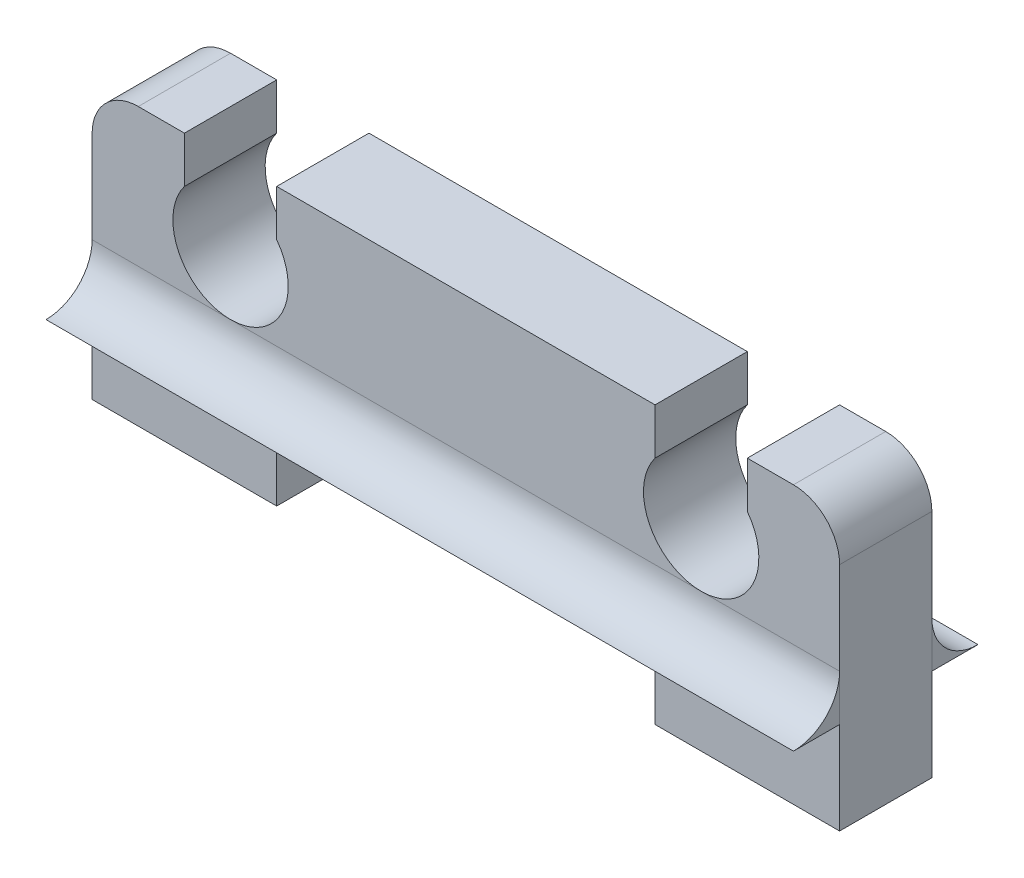
ISO-10303-21;
HEADER;
FILE_DESCRIPTION(('STEP AP214'),'2;1');
FILE_NAME('part.step','',(''),(''),'','','');
FILE_SCHEMA(('AUTOMOTIVE_DESIGN { 1 0 10303 214 1 1 1 1 }'));
ENDSEC;
DATA;
#1=APPLICATION_CONTEXT('core data for automotive mechanical design processes');
#2=APPLICATION_PROTOCOL_DEFINITION('international standard','automotive_design',2000,#1);
#3=PRODUCT_CONTEXT('',#1,'mechanical');
#4=PRODUCT('Part','Part','',(#3));
#5=PRODUCT_RELATED_PRODUCT_CATEGORY('part','',(#4));
#6=PRODUCT_DEFINITION_FORMATION('','',#4);
#7=PRODUCT_DEFINITION_CONTEXT('part definition',#1,'design');
#8=PRODUCT_DEFINITION('design','',#6,#7);
#9=PRODUCT_DEFINITION_SHAPE('','',#8);
#10=(LENGTH_UNIT() NAMED_UNIT(*) SI_UNIT(.MILLI.,.METRE.));
#11=(NAMED_UNIT(*) PLANE_ANGLE_UNIT() SI_UNIT($,.RADIAN.));
#12=(NAMED_UNIT(*) SI_UNIT($,.STERADIAN.) SOLID_ANGLE_UNIT());
#13=UNCERTAINTY_MEASURE_WITH_UNIT(LENGTH_MEASURE(1.E-05),#10,'distance_accuracy_value','');
#14=(GEOMETRIC_REPRESENTATION_CONTEXT(3) GLOBAL_UNCERTAINTY_ASSIGNED_CONTEXT((#13)) GLOBAL_UNIT_ASSIGNED_CONTEXT((#10,
#11,#12)) REPRESENTATION_CONTEXT('',''));
#15=CARTESIAN_POINT('',(0.,0.,0.));
#16=DIRECTION('',(0.,0.,1.));
#17=DIRECTION('',(1.,0.,0.));
#18=AXIS2_PLACEMENT_3D('',#15,#16,#17);
#19=CARTESIAN_POINT('',(16.2,5.,-1.));
#20=DIRECTION('',(-1.,0.,0.));
#21=DIRECTION('',(0.,0.,1.));
#22=AXIS2_PLACEMENT_3D('',#19,#20,#21);
#23=CYLINDRICAL_SURFACE('',#22,1.);
#24=CARTESIAN_POINT('',(0.,5.,-1.));
#25=DIRECTION('',(1.,0.,0.));
#26=DIRECTION('',(0.,0.,-1.));
#27=AXIS2_PLACEMENT_3D('',#24,#25,#26);
#28=CIRCLE('',#27,1.);
#29=CARTESIAN_POINT('',(0.,5.,0.));
#30=VERTEX_POINT('',#29);
#31=CARTESIAN_POINT('',(0.,4.,-1.));
#32=VERTEX_POINT('',#31);
#33=EDGE_CURVE('E97',#30,#32,#28,.T.);
#34=ORIENTED_EDGE('',*,*,#33,.F.);
#35=DIRECTION('',(-1.,0.,0.));
#36=VECTOR('',#35,1.);
#37=CARTESIAN_POINT('',(16.2,5.,0.));
#38=LINE('',#37,#36);
#39=CARTESIAN_POINT('',(16.2,5.,0.));
#40=VERTEX_POINT('',#39);
#41=EDGE_CURVE('E12',#40,#30,#38,.T.);
#42=ORIENTED_EDGE('',*,*,#41,.F.);
#43=CARTESIAN_POINT('',(16.2,5.,-1.));
#44=DIRECTION('',(1.,0.,0.));
#45=DIRECTION('',(0.,0.,-1.));
#46=AXIS2_PLACEMENT_3D('',#43,#44,#45);
#47=CIRCLE('',#46,1.);
#48=CARTESIAN_POINT('',(16.2,4.,-1.));
#49=VERTEX_POINT('',#48);
#50=EDGE_CURVE('E89',#40,#49,#47,.T.);
#51=ORIENTED_EDGE('',*,*,#50,.T.);
#52=DIRECTION('',(-1.,0.,0.));
#53=VECTOR('',#52,1.);
#54=CARTESIAN_POINT('',(16.2,4.,-1.));
#55=LINE('',#54,#53);
#56=EDGE_CURVE('E48',#49,#32,#55,.T.);
#57=ORIENTED_EDGE('',*,*,#56,.T.);
#58=EDGE_LOOP('',(#34,#42,#51,#57));
#59=FACE_BOUND('',#58,.T.);
#60=ADVANCED_FACE('F45',(#59),#23,.F.);
#61=CARTESIAN_POINT('',(16.2,4.,0.));
#62=DIRECTION('',(0.,0.,1.));
#63=DIRECTION('',(1.,0.,0.));
#64=AXIS2_PLACEMENT_3D('',#61,#62,#63);
#65=PLANE('',#64);
#66=DIRECTION('',(0.,1.,0.));
#67=VECTOR('',#66,1.);
#68=CARTESIAN_POINT('',(0.,4.,0.));
#69=LINE('',#68,#67);
#70=CARTESIAN_POINT('',(0.,4.,0.));
#71=VERTEX_POINT('',#70);
#72=EDGE_CURVE('E91',#71,#30,#69,.T.);
#73=ORIENTED_EDGE('',*,*,#72,.F.);
#74=DIRECTION('',(-1.,0.,0.));
#75=VECTOR('',#74,1.);
#76=CARTESIAN_POINT('',(16.2,4.,0.));
#77=LINE('',#76,#75);
#78=CARTESIAN_POINT('',(16.2,4.,0.));
#79=VERTEX_POINT('',#78);
#80=EDGE_CURVE('E54',#79,#71,#77,.T.);
#81=ORIENTED_EDGE('',*,*,#80,.F.);
#82=DIRECTION('',(0.,1.,0.));
#83=VECTOR('',#82,1.);
#84=CARTESIAN_POINT('',(16.2,4.,0.));
#85=LINE('',#84,#83);
#86=EDGE_CURVE('E86',#79,#40,#85,.T.);
#87=ORIENTED_EDGE('',*,*,#86,.T.);
#88=ORIENTED_EDGE('',*,*,#41,.T.);
#89=EDGE_LOOP('',(#73,#81,#87,#88));
#90=FACE_BOUND('',#89,.T.);
#91=ADVANCED_FACE('F101',(#90),#65,.T.);
#92=CARTESIAN_POINT('',(16.2,4.,0.));
#93=DIRECTION('',(0.,-1.,0.));
#94=DIRECTION('',(0.,0.,-1.));
#95=AXIS2_PLACEMENT_3D('',#92,#93,#94);
#96=PLANE('',#95);
#97=DIRECTION('',(0.,0.,1.));
#98=VECTOR('',#97,1.);
#99=CARTESIAN_POINT('',(0.,4.,0.));
#100=LINE('',#99,#98);
#101=EDGE_CURVE('E84',#32,#71,#100,.T.);
#102=ORIENTED_EDGE('',*,*,#101,.F.);
#103=ORIENTED_EDGE('',*,*,#56,.F.);
#104=DIRECTION('',(0.,0.,1.));
#105=VECTOR('',#104,1.);
#106=CARTESIAN_POINT('',(16.2,4.,0.));
#107=LINE('',#106,#105);
#108=EDGE_CURVE('E82',#49,#79,#107,.T.);
#109=ORIENTED_EDGE('',*,*,#108,.T.);
#110=ORIENTED_EDGE('',*,*,#80,.T.);
#111=EDGE_LOOP('',(#102,#103,#109,#110));
#112=FACE_BOUND('',#111,.T.);
#113=ADVANCED_FACE('F81',(#112),#96,.T.);
#114=CARTESIAN_POINT('',(16.2,5.,-1.));
#115=DIRECTION('',(1.,0.,0.));
#116=DIRECTION('',(0.,0.,-1.));
#117=AXIS2_PLACEMENT_3D('',#114,#115,#116);
#118=PLANE('',#117);
#119=ORIENTED_EDGE('',*,*,#50,.F.);
#120=ORIENTED_EDGE('',*,*,#86,.F.);
#121=ORIENTED_EDGE('',*,*,#108,.F.);
#122=EDGE_LOOP('',(#119,#120,#121));
#123=FACE_BOUND('',#122,.T.);
#124=ADVANCED_FACE('F88',(#123),#118,.T.);
#125=CARTESIAN_POINT('',(0.,5.,-1.));
#126=DIRECTION('',(1.,0.,0.));
#127=DIRECTION('',(0.,0.,-1.));
#128=AXIS2_PLACEMENT_3D('',#125,#126,#127);
#129=PLANE('',#128);
#130=ORIENTED_EDGE('',*,*,#33,.T.);
#131=ORIENTED_EDGE('',*,*,#101,.T.);
#132=ORIENTED_EDGE('',*,*,#72,.T.);
#133=EDGE_LOOP('',(#130,#131,#132));
#134=FACE_BOUND('',#133,.T.);
#135=ADVANCED_FACE('F100',(#134),#129,.F.);
#136=CLOSED_SHELL('',(#60,#91,#113,#124,#135));
#137=MANIFOLD_SOLID_BREP('B2',#136);
#138=CARTESIAN_POINT('',(16.2,4.,2.));
#139=DIRECTION('',(0.,-1.,0.));
#140=DIRECTION('',(0.,0.,-1.));
#141=AXIS2_PLACEMENT_3D('',#138,#139,#140);
#142=PLANE('',#141);
#143=DIRECTION('',(0.,0.,1.));
#144=VECTOR('',#143,1.);
#145=CARTESIAN_POINT('',(0.,4.,2.));
#146=LINE('',#145,#144);
#147=CARTESIAN_POINT('',(0.,4.,2.));
#148=VERTEX_POINT('',#147);
#149=CARTESIAN_POINT('',(0.,4.,3.));
#150=VERTEX_POINT('',#149);
#151=EDGE_CURVE('E203',#148,#150,#146,.T.);
#152=ORIENTED_EDGE('',*,*,#151,.F.);
#153=DIRECTION('',(-1.,0.,0.));
#154=VECTOR('',#153,1.);
#155=CARTESIAN_POINT('',(16.2,4.,2.));
#156=LINE('',#155,#154);
#157=CARTESIAN_POINT('',(16.2,4.,2.));
#158=VERTEX_POINT('',#157);
#159=EDGE_CURVE('E43',#158,#148,#156,.T.);
#160=ORIENTED_EDGE('',*,*,#159,.F.);
#161=DIRECTION('',(0.,0.,1.));
#162=VECTOR('',#161,1.);
#163=CARTESIAN_POINT('',(16.2,4.,2.));
#164=LINE('',#163,#162);
#165=CARTESIAN_POINT('',(16.2,4.,3.));
#166=VERTEX_POINT('',#165);
#167=EDGE_CURVE('E195',#158,#166,#164,.T.);
#168=ORIENTED_EDGE('',*,*,#167,.T.);
#169=DIRECTION('',(-1.,0.,0.));
#170=VECTOR('',#169,1.);
#171=CARTESIAN_POINT('',(16.2,4.,3.));
#172=LINE('',#171,#170);
#173=EDGE_CURVE('E154',#166,#150,#172,.T.);
#174=ORIENTED_EDGE('',*,*,#173,.T.);
#175=EDGE_LOOP('',(#152,#160,#168,#174));
#176=FACE_BOUND('',#175,.T.);
#177=ADVANCED_FACE('F151',(#176),#142,.T.);
#178=CARTESIAN_POINT('',(16.2,4.,2.));
#179=DIRECTION('',(0.,0.,-1.));
#180=DIRECTION('',(-1.,0.,0.));
#181=AXIS2_PLACEMENT_3D('',#178,#179,#180);
#182=PLANE('',#181);
#183=DIRECTION('',(0.,-1.,0.));
#184=VECTOR('',#183,1.);
#185=CARTESIAN_POINT('',(0.,4.,2.));
#186=LINE('',#185,#184);
#187=CARTESIAN_POINT('',(0.,5.,2.));
#188=VERTEX_POINT('',#187);
#189=EDGE_CURVE('E197',#188,#148,#186,.T.);
#190=ORIENTED_EDGE('',*,*,#189,.F.);
#191=DIRECTION('',(-1.,0.,0.));
#192=VECTOR('',#191,1.);
#193=CARTESIAN_POINT('',(16.2,5.,2.));
#194=LINE('',#193,#192);
#195=CARTESIAN_POINT('',(16.2,5.,2.));
#196=VERTEX_POINT('',#195);
#197=EDGE_CURVE('E160',#196,#188,#194,.T.);
#198=ORIENTED_EDGE('',*,*,#197,.F.);
#199=DIRECTION('',(0.,-1.,0.));
#200=VECTOR('',#199,1.);
#201=CARTESIAN_POINT('',(16.2,4.,2.));
#202=LINE('',#201,#200);
#203=EDGE_CURVE('E192',#196,#158,#202,.T.);
#204=ORIENTED_EDGE('',*,*,#203,.T.);
#205=ORIENTED_EDGE('',*,*,#159,.T.);
#206=EDGE_LOOP('',(#190,#198,#204,#205));
#207=FACE_BOUND('',#206,.T.);
#208=ADVANCED_FACE('F207',(#207),#182,.T.);
#209=CARTESIAN_POINT('',(16.2,5.,3.));
#210=DIRECTION('',(-1.,0.,0.));
#211=DIRECTION('',(0.,0.,1.));
#212=AXIS2_PLACEMENT_3D('',#209,#210,#211);
#213=CYLINDRICAL_SURFACE('',#212,1.);
#214=CARTESIAN_POINT('',(0.,5.,3.));
#215=DIRECTION('',(1.,0.,0.));
#216=DIRECTION('',(0.,0.,1.));
#217=AXIS2_PLACEMENT_3D('',#214,#215,#216);
#218=CIRCLE('',#217,1.);
#219=EDGE_CURVE('E190',#150,#188,#218,.T.);
#220=ORIENTED_EDGE('',*,*,#219,.F.);
#221=ORIENTED_EDGE('',*,*,#173,.F.);
#222=CARTESIAN_POINT('',(16.2,5.,3.));
#223=DIRECTION('',(1.,0.,0.));
#224=DIRECTION('',(0.,0.,1.));
#225=AXIS2_PLACEMENT_3D('',#222,#223,#224);
#226=CIRCLE('',#225,1.);
#227=EDGE_CURVE('E188',#166,#196,#226,.T.);
#228=ORIENTED_EDGE('',*,*,#227,.T.);
#229=ORIENTED_EDGE('',*,*,#197,.T.);
#230=EDGE_LOOP('',(#220,#221,#228,#229));
#231=FACE_BOUND('',#230,.T.);
#232=ADVANCED_FACE('F187',(#231),#213,.F.);
#233=CARTESIAN_POINT('',(16.2,5.,3.));
#234=DIRECTION('',(-1.,0.,0.));
#235=DIRECTION('',(0.,0.,1.));
#236=AXIS2_PLACEMENT_3D('',#233,#234,#235);
#237=PLANE('',#236);
#238=ORIENTED_EDGE('',*,*,#167,.F.);
#239=ORIENTED_EDGE('',*,*,#203,.F.);
#240=ORIENTED_EDGE('',*,*,#227,.F.);
#241=EDGE_LOOP('',(#238,#239,#240));
#242=FACE_BOUND('',#241,.T.);
#243=ADVANCED_FACE('F194',(#242),#237,.F.);
#244=CARTESIAN_POINT('',(0.,5.,3.));
#245=DIRECTION('',(-1.,0.,0.));
#246=DIRECTION('',(0.,0.,1.));
#247=AXIS2_PLACEMENT_3D('',#244,#245,#246);
#248=PLANE('',#247);
#249=ORIENTED_EDGE('',*,*,#151,.T.);
#250=ORIENTED_EDGE('',*,*,#219,.T.);
#251=ORIENTED_EDGE('',*,*,#189,.T.);
#252=EDGE_LOOP('',(#249,#250,#251));
#253=FACE_BOUND('',#252,.T.);
#254=ADVANCED_FACE('F206',(#253),#248,.T.);
#255=CLOSED_SHELL('',(#177,#208,#232,#243,#254));
#256=MANIFOLD_SOLID_BREP('B6',#255);
#257=CARTESIAN_POINT('',(4.00000000000054,0.,2.));
#258=DIRECTION('',(-1.,0.,0.));
#259=DIRECTION('',(0.,-1.,0.));
#260=AXIS2_PLACEMENT_3D('',#257,#258,#259);
#261=PLANE('',#260);
#262=DIRECTION('',(0.,1.,0.));
#263=VECTOR('',#262,1.);
#264=CARTESIAN_POINT('',(4.00000000000054,0.,2.));
#265=LINE('',#264,#263);
#266=CARTESIAN_POINT('',(4.00000000000054,2.,2.));
#267=VERTEX_POINT('',#266);
#268=CARTESIAN_POINT('',(4.00000000000055,4.,2.));
#269=VERTEX_POINT('',#268);
#270=EDGE_CURVE('E454',#267,#269,#265,.T.);
#271=ORIENTED_EDGE('',*,*,#270,.F.);
#272=DIRECTION('',(0.,0.,1.));
#273=VECTOR('',#272,1.);
#274=CARTESIAN_POINT('',(4.00000000000054,2.,-1.));
#275=LINE('',#274,#273);
#276=CARTESIAN_POINT('',(4.00000000000054,2.,0.));
#277=VERTEX_POINT('',#276);
#278=EDGE_CURVE('E495',#277,#267,#275,.T.);
#279=ORIENTED_EDGE('',*,*,#278,.F.);
#280=DIRECTION('',(0.,1.,0.));
#281=VECTOR('',#280,1.);
#282=CARTESIAN_POINT('',(4.00000000000054,0.,0.));
#283=LINE('',#282,#281);
#284=CARTESIAN_POINT('',(4.00000000000055,4.,0.));
#285=VERTEX_POINT('',#284);
#286=EDGE_CURVE('E420',#277,#285,#283,.T.);
#287=ORIENTED_EDGE('',*,*,#286,.T.);
#288=DIRECTION('',(0.,0.,-1.));
#289=VECTOR('',#288,1.);
#290=CARTESIAN_POINT('',(4.00000000000055,4.,2.));
#291=LINE('',#290,#289);
#292=EDGE_CURVE('E491',#269,#285,#291,.T.);
#293=ORIENTED_EDGE('',*,*,#292,.F.);
#294=EDGE_LOOP('',(#271,#279,#287,#293));
#295=FACE_BOUND('',#294,.T.);
#296=ADVANCED_FACE('F248',(#295),#261,.F.);
#297=CARTESIAN_POINT('',(4.00000000000055,4.,2.));
#298=DIRECTION('',(0.,1.,0.));
#299=DIRECTION('',(-1.,0.,0.));
#300=AXIS2_PLACEMENT_3D('',#297,#298,#299);
#301=PLANE('',#300);
#302=DIRECTION('',(1.,0.,0.));
#303=VECTOR('',#302,1.);
#304=CARTESIAN_POINT('',(4.00000000000055,4.,0.));
#305=LINE('',#304,#303);
#306=CARTESIAN_POINT('',(12.1999999999995,4.,0.));
#307=VERTEX_POINT('',#306);
#308=EDGE_CURVE('E422',#285,#307,#305,.T.);
#309=ORIENTED_EDGE('',*,*,#308,.T.);
#310=DIRECTION('',(0.,0.,-1.));
#311=VECTOR('',#310,1.);
#312=CARTESIAN_POINT('',(12.1999999999995,4.,2.));
#313=LINE('',#312,#311);
#314=CARTESIAN_POINT('',(12.1999999999995,4.,2.));
#315=VERTEX_POINT('',#314);
#316=EDGE_CURVE('E488',#315,#307,#313,.T.);
#317=ORIENTED_EDGE('',*,*,#316,.F.);
#318=DIRECTION('',(1.,0.,0.));
#319=VECTOR('',#318,1.);
#320=CARTESIAN_POINT('',(4.00000000000055,4.,2.));
#321=LINE('',#320,#319);
#322=EDGE_CURVE('E393',#269,#315,#321,.T.);
#323=ORIENTED_EDGE('',*,*,#322,.F.);
#324=ORIENTED_EDGE('',*,*,#292,.T.);
#325=EDGE_LOOP('',(#309,#317,#323,#324));
#326=FACE_BOUND('',#325,.T.);
#327=ADVANCED_FACE('F511',(#326),#301,.F.);
#328=CARTESIAN_POINT('',(12.1999999999995,0.,2.));
#329=DIRECTION('',(1.,0.,0.));
#330=DIRECTION('',(0.,0.,-1.));
#331=AXIS2_PLACEMENT_3D('',#328,#329,#330);
#332=PLANE('',#331);
#333=DIRECTION('',(0.,-1.,0.));
#334=VECTOR('',#333,1.);
#335=CARTESIAN_POINT('',(12.1999999999995,0.,0.));
#336=LINE('',#335,#334);
#337=CARTESIAN_POINT('',(12.1999999999995,2.,0.));
#338=VERTEX_POINT('',#337);
#339=EDGE_CURVE('E424',#307,#338,#336,.T.);
#340=ORIENTED_EDGE('',*,*,#339,.T.);
#341=DIRECTION('',(0.,0.,1.));
#342=VECTOR('',#341,1.);
#343=CARTESIAN_POINT('',(12.1999999999995,2.,-1.));
#344=LINE('',#343,#342);
#345=CARTESIAN_POINT('',(12.1999999999995,2.,2.));
#346=VERTEX_POINT('',#345);
#347=EDGE_CURVE('E261',#338,#346,#344,.T.);
#348=ORIENTED_EDGE('',*,*,#347,.T.);
#349=DIRECTION('',(0.,-1.,0.));
#350=VECTOR('',#349,1.);
#351=CARTESIAN_POINT('',(12.1999999999995,0.,2.));
#352=LINE('',#351,#350);
#353=EDGE_CURVE('E383',#315,#346,#352,.T.);
#354=ORIENTED_EDGE('',*,*,#353,.F.);
#355=ORIENTED_EDGE('',*,*,#316,.T.);
#356=EDGE_LOOP('',(#340,#348,#354,#355));
#357=FACE_BOUND('',#356,.T.);
#358=ADVANCED_FACE('F517',(#357),#332,.F.);
#359=CARTESIAN_POINT('',(16.2,0.,2.));
#360=DIRECTION('',(-1.,0.,0.));
#361=DIRECTION('',(0.,-1.,0.));
#362=AXIS2_PLACEMENT_3D('',#359,#360,#361);
#363=PLANE('',#362);
#364=DIRECTION('',(0.,1.,0.));
#365=VECTOR('',#364,1.);
#366=CARTESIAN_POINT('',(16.2,0.,2.));
#367=LINE('',#366,#365);
#368=CARTESIAN_POINT('',(16.2,2.,2.));
#369=VERTEX_POINT('',#368);
#370=CARTESIAN_POINT('',(16.2,7.00000000000066,2.));
#371=VERTEX_POINT('',#370);
#372=EDGE_CURVE('E380',#369,#371,#367,.T.);
#373=ORIENTED_EDGE('',*,*,#372,.F.);
#374=DIRECTION('',(0.,0.,1.));
#375=VECTOR('',#374,1.);
#376=CARTESIAN_POINT('',(16.2,2.,-1.));
#377=LINE('',#376,#375);
#378=CARTESIAN_POINT('',(16.2,2.,0.));
#379=VERTEX_POINT('',#378);
#380=EDGE_CURVE('E369',#379,#369,#377,.T.);
#381=ORIENTED_EDGE('',*,*,#380,.F.);
#382=DIRECTION('',(0.,1.,0.));
#383=VECTOR('',#382,1.);
#384=CARTESIAN_POINT('',(16.2,0.,0.));
#385=LINE('',#384,#383);
#386=CARTESIAN_POINT('',(16.2,7.00000000000066,0.));
#387=VERTEX_POINT('',#386);
#388=EDGE_CURVE('E427',#379,#387,#385,.T.);
#389=ORIENTED_EDGE('',*,*,#388,.T.);
#390=DIRECTION('',(0.,0.,-1.));
#391=VECTOR('',#390,1.);
#392=CARTESIAN_POINT('',(16.2,7.00000000000066,2.));
#393=LINE('',#392,#391);
#394=EDGE_CURVE('E387',#371,#387,#393,.T.);
#395=ORIENTED_EDGE('',*,*,#394,.F.);
#396=EDGE_LOOP('',(#373,#381,#389,#395));
#397=FACE_BOUND('',#396,.T.);
#398=ADVANCED_FACE('F385',(#397),#363,.F.);
#399=CARTESIAN_POINT('',(15.2000000000001,7.00000000000066,2.));
#400=DIRECTION('',(0.,0.,-1.));
#401=DIRECTION('',(-1.,0.,0.));
#402=AXIS2_PLACEMENT_3D('',#399,#400,#401);
#403=CYLINDRICAL_SURFACE('',#402,0.99999999999989);
#404=CARTESIAN_POINT('',(15.2000000000001,7.00000000000066,0.));
#405=DIRECTION('',(0.,0.,1.));
#406=DIRECTION('',(-1.,0.,0.));
#407=AXIS2_PLACEMENT_3D('',#404,#405,#406);
#408=CIRCLE('',#407,0.99999999999989);
#409=CARTESIAN_POINT('',(15.2000000000001,8.00000000000055,0.));
#410=VERTEX_POINT('',#409);
#411=EDGE_CURVE('E429',#387,#410,#408,.T.);
#412=ORIENTED_EDGE('',*,*,#411,.T.);
#413=DIRECTION('',(0.,0.,-1.));
#414=VECTOR('',#413,1.);
#415=CARTESIAN_POINT('',(15.2000000000001,8.00000000000055,2.));
#416=LINE('',#415,#414);
#417=CARTESIAN_POINT('',(15.2000000000001,8.00000000000055,2.));
#418=VERTEX_POINT('',#417);
#419=EDGE_CURVE('E484',#418,#410,#416,.T.);
#420=ORIENTED_EDGE('',*,*,#419,.F.);
#421=CARTESIAN_POINT('',(15.2000000000001,7.00000000000066,2.));
#422=DIRECTION('',(0.,0.,1.));
#423=DIRECTION('',(-1.,0.,0.));
#424=AXIS2_PLACEMENT_3D('',#421,#422,#423);
#425=CIRCLE('',#424,0.99999999999989);
#426=EDGE_CURVE('E389',#371,#418,#425,.T.);
#427=ORIENTED_EDGE('',*,*,#426,.F.);
#428=ORIENTED_EDGE('',*,*,#394,.T.);
#429=EDGE_LOOP('',(#412,#420,#427,#428));
#430=FACE_BOUND('',#429,.T.);
#431=ADVANCED_FACE('F524',(#430),#403,.T.);
#432=CARTESIAN_POINT('',(14.2000000000002,8.00000000000055,2.));
#433=DIRECTION('',(0.,-1.,0.));
#434=DIRECTION('',(1.,0.,0.));
#435=AXIS2_PLACEMENT_3D('',#432,#433,#434);
#436=PLANE('',#435);
#437=DIRECTION('',(-1.,0.,0.));
#438=VECTOR('',#437,1.);
#439=CARTESIAN_POINT('',(14.2000000000002,8.00000000000055,0.));
#440=LINE('',#439,#438);
#441=CARTESIAN_POINT('',(14.2000000000002,8.00000000000055,0.));
#442=VERTEX_POINT('',#441);
#443=EDGE_CURVE('E431',#410,#442,#440,.T.);
#444=ORIENTED_EDGE('',*,*,#443,.T.);
#445=DIRECTION('',(0.,0.,-1.));
#446=VECTOR('',#445,1.);
#447=CARTESIAN_POINT('',(14.2000000000002,8.00000000000055,2.));
#448=LINE('',#447,#446);
#449=CARTESIAN_POINT('',(14.2000000000002,8.00000000000055,2.));
#450=VERTEX_POINT('',#449);
#451=EDGE_CURVE('E481',#450,#442,#448,.T.);
#452=ORIENTED_EDGE('',*,*,#451,.F.);
#453=DIRECTION('',(-1.,0.,0.));
#454=VECTOR('',#453,1.);
#455=CARTESIAN_POINT('',(14.2000000000002,8.00000000000055,2.));
#456=LINE('',#455,#454);
#457=EDGE_CURVE('E391',#418,#450,#456,.T.);
#458=ORIENTED_EDGE('',*,*,#457,.F.);
#459=ORIENTED_EDGE('',*,*,#419,.T.);
#460=EDGE_LOOP('',(#444,#452,#458,#459));
#461=FACE_BOUND('',#460,.T.);
#462=ADVANCED_FACE('F544',(#461),#436,.F.);
#463=CARTESIAN_POINT('',(14.2000000000002,8.00000000000055,2.));
#464=DIRECTION('',(1.,0.,0.));
#465=DIRECTION('',(0.,0.,-1.));
#466=AXIS2_PLACEMENT_3D('',#463,#464,#465);
#467=PLANE('',#466);
#468=DIRECTION('',(0.,-1.,0.));
#469=VECTOR('',#468,1.);
#470=CARTESIAN_POINT('',(14.2000000000002,8.00000000000055,0.));
#471=LINE('',#470,#469);
#472=CARTESIAN_POINT('',(14.2000000000002,7.00000000000066,0.));
#473=VERTEX_POINT('',#472);
#474=EDGE_CURVE('E433',#442,#473,#471,.T.);
#475=ORIENTED_EDGE('',*,*,#474,.T.);
#476=DIRECTION('',(0.,0.,-1.));
#477=VECTOR('',#476,1.);
#478=CARTESIAN_POINT('',(14.2000000000002,7.00000000000066,2.));
#479=LINE('',#478,#477);
#480=CARTESIAN_POINT('',(14.2000000000002,7.00000000000066,2.));
#481=VERTEX_POINT('',#480);
#482=EDGE_CURVE('E478',#481,#473,#479,.T.);
#483=ORIENTED_EDGE('',*,*,#482,.F.);
#484=DIRECTION('',(0.,-1.,0.));
#485=VECTOR('',#484,1.);
#486=CARTESIAN_POINT('',(14.2000000000002,8.00000000000055,2.));
#487=LINE('',#486,#485);
#488=EDGE_CURVE('E398',#450,#481,#487,.T.);
#489=ORIENTED_EDGE('',*,*,#488,.F.);
#490=ORIENTED_EDGE('',*,*,#451,.T.);
#491=EDGE_LOOP('',(#475,#483,#489,#490));
#492=FACE_BOUND('',#491,.T.);
#493=ADVANCED_FACE('F555',(#492),#467,.F.);
#494=CARTESIAN_POINT('',(13.1999999999998,6.2500000000016,2.));
#495=DIRECTION('',(0.,0.,-1.));
#496=DIRECTION('',(-1.,0.,0.));
#497=AXIS2_PLACEMENT_3D('',#494,#495,#496);
#498=CYLINDRICAL_SURFACE('',#497,1.24999999999974);
#499=CARTESIAN_POINT('',(13.1999999999998,6.2500000000016,0.));
#500=DIRECTION('',(0.,0.,-1.));
#501=DIRECTION('',(-1.,0.,0.));
#502=AXIS2_PLACEMENT_3D('',#499,#500,#501);
#503=CIRCLE('',#502,1.24999999999974);
#504=CARTESIAN_POINT('',(12.1999999999994,7.00000000000065,0.));
#505=VERTEX_POINT('',#504);
#506=EDGE_CURVE('E435',#473,#505,#503,.T.);
#507=ORIENTED_EDGE('',*,*,#506,.T.);
#508=DIRECTION('',(0.,0.,-1.));
#509=VECTOR('',#508,1.);
#510=CARTESIAN_POINT('',(12.1999999999994,7.00000000000065,2.));
#511=LINE('',#510,#509);
#512=CARTESIAN_POINT('',(12.1999999999994,7.00000000000065,2.));
#513=VERTEX_POINT('',#512);
#514=EDGE_CURVE('E475',#513,#505,#511,.T.);
#515=ORIENTED_EDGE('',*,*,#514,.F.);
#516=CARTESIAN_POINT('',(13.1999999999998,6.2500000000016,2.));
#517=DIRECTION('',(0.,0.,-1.));
#518=DIRECTION('',(-1.,0.,0.));
#519=AXIS2_PLACEMENT_3D('',#516,#517,#518);
#520=CIRCLE('',#519,1.24999999999974);
#521=EDGE_CURVE('E400',#481,#513,#520,.T.);
#522=ORIENTED_EDGE('',*,*,#521,.F.);
#523=ORIENTED_EDGE('',*,*,#482,.T.);
#524=EDGE_LOOP('',(#507,#515,#522,#523));
#525=FACE_BOUND('',#524,.T.);
#526=ADVANCED_FACE('F565',(#525),#498,.F.);
#527=CARTESIAN_POINT('',(12.1999999999994,8.00000000000054,2.));
#528=DIRECTION('',(-1.,0.,0.));
#529=DIRECTION('',(0.,0.,1.));
#530=AXIS2_PLACEMENT_3D('',#527,#528,#529);
#531=PLANE('',#530);
#532=DIRECTION('',(0.,1.,0.));
#533=VECTOR('',#532,1.);
#534=CARTESIAN_POINT('',(12.1999999999994,8.00000000000054,0.));
#535=LINE('',#534,#533);
#536=CARTESIAN_POINT('',(12.1999999999994,8.00000000000054,0.));
#537=VERTEX_POINT('',#536);
#538=EDGE_CURVE('E437',#505,#537,#535,.T.);
#539=ORIENTED_EDGE('',*,*,#538,.T.);
#540=DIRECTION('',(0.,0.,-1.));
#541=VECTOR('',#540,1.);
#542=CARTESIAN_POINT('',(12.1999999999994,8.00000000000054,2.));
#543=LINE('',#542,#541);
#544=CARTESIAN_POINT('',(12.1999999999994,8.00000000000054,2.));
#545=VERTEX_POINT('',#544);
#546=EDGE_CURVE('E472',#545,#537,#543,.T.);
#547=ORIENTED_EDGE('',*,*,#546,.F.);
#548=DIRECTION('',(0.,1.,0.));
#549=VECTOR('',#548,1.);
#550=CARTESIAN_POINT('',(12.1999999999994,8.00000000000054,2.));
#551=LINE('',#550,#549);
#552=EDGE_CURVE('E402',#513,#545,#551,.T.);
#553=ORIENTED_EDGE('',*,*,#552,.F.);
#554=ORIENTED_EDGE('',*,*,#514,.T.);
#555=EDGE_LOOP('',(#539,#547,#553,#554));
#556=FACE_BOUND('',#555,.T.);
#557=ADVANCED_FACE('F575',(#556),#531,.F.);
#558=CARTESIAN_POINT('',(4.00000000000055,8.00000000000055,2.));
#559=DIRECTION('',(0.,-1.,0.));
#560=DIRECTION('',(1.,0.,0.));
#561=AXIS2_PLACEMENT_3D('',#558,#559,#560);
#562=PLANE('',#561);
#563=DIRECTION('',(-1.,0.,0.));
#564=VECTOR('',#563,1.);
#565=CARTESIAN_POINT('',(4.00000000000055,8.00000000000055,0.));
#566=LINE('',#565,#564);
#567=CARTESIAN_POINT('',(4.00000000000055,8.00000000000055,0.));
#568=VERTEX_POINT('',#567);
#569=EDGE_CURVE('E439',#537,#568,#566,.T.);
#570=ORIENTED_EDGE('',*,*,#569,.T.);
#571=DIRECTION('',(0.,0.,-1.));
#572=VECTOR('',#571,1.);
#573=CARTESIAN_POINT('',(4.00000000000055,8.00000000000055,2.));
#574=LINE('',#573,#572);
#575=CARTESIAN_POINT('',(4.00000000000055,8.00000000000055,2.));
#576=VERTEX_POINT('',#575);
#577=EDGE_CURVE('E469',#576,#568,#574,.T.);
#578=ORIENTED_EDGE('',*,*,#577,.F.);
#579=DIRECTION('',(-1.,0.,0.));
#580=VECTOR('',#579,1.);
#581=CARTESIAN_POINT('',(4.00000000000055,8.00000000000055,2.));
#582=LINE('',#581,#580);
#583=EDGE_CURVE('E404',#545,#576,#582,.T.);
#584=ORIENTED_EDGE('',*,*,#583,.F.);
#585=ORIENTED_EDGE('',*,*,#546,.T.);
#586=EDGE_LOOP('',(#570,#578,#584,#585));
#587=FACE_BOUND('',#586,.T.);
#588=ADVANCED_FACE('F585',(#587),#562,.F.);
#589=CARTESIAN_POINT('',(4.00000000000055,8.00000000000055,2.));
#590=DIRECTION('',(1.,0.,0.));
#591=DIRECTION('',(0.,0.,-1.));
#592=AXIS2_PLACEMENT_3D('',#589,#590,#591);
#593=PLANE('',#592);
#594=DIRECTION('',(0.,-1.,0.));
#595=VECTOR('',#594,1.);
#596=CARTESIAN_POINT('',(4.00000000000055,8.00000000000055,0.));
#597=LINE('',#596,#595);
#598=CARTESIAN_POINT('',(4.00000000000055,7.00000000000065,0.));
#599=VERTEX_POINT('',#598);
#600=EDGE_CURVE('E441',#568,#599,#597,.T.);
#601=ORIENTED_EDGE('',*,*,#600,.T.);
#602=DIRECTION('',(0.,0.,-1.));
#603=VECTOR('',#602,1.);
#604=CARTESIAN_POINT('',(4.00000000000055,7.00000000000065,2.));
#605=LINE('',#604,#603);
#606=CARTESIAN_POINT('',(4.00000000000055,7.00000000000065,2.));
#607=VERTEX_POINT('',#606);
#608=EDGE_CURVE('E466',#607,#599,#605,.T.);
#609=ORIENTED_EDGE('',*,*,#608,.F.);
#610=DIRECTION('',(0.,-1.,0.));
#611=VECTOR('',#610,1.);
#612=CARTESIAN_POINT('',(4.00000000000055,8.00000000000055,2.));
#613=LINE('',#612,#611);
#614=EDGE_CURVE('E406',#576,#607,#613,.T.);
#615=ORIENTED_EDGE('',*,*,#614,.F.);
#616=ORIENTED_EDGE('',*,*,#577,.T.);
#617=EDGE_LOOP('',(#601,#609,#615,#616));
#618=FACE_BOUND('',#617,.T.);
#619=ADVANCED_FACE('F595',(#618),#593,.F.);
#620=CARTESIAN_POINT('',(3.00000000000016,6.2500000000016,2.));
#621=DIRECTION('',(0.,0.,-1.));
#622=DIRECTION('',(-1.,0.,0.));
#623=AXIS2_PLACEMENT_3D('',#620,#621,#622);
#624=CYLINDRICAL_SURFACE('',#623,1.24999999999974);
#625=CARTESIAN_POINT('',(3.00000000000016,6.2500000000016,0.));
#626=DIRECTION('',(0.,0.,-1.));
#627=DIRECTION('',(1.,0.,0.));
#628=AXIS2_PLACEMENT_3D('',#625,#626,#627);
#629=CIRCLE('',#628,1.24999999999974);
#630=CARTESIAN_POINT('',(1.99999999999978,7.00000000000065,0.));
#631=VERTEX_POINT('',#630);
#632=EDGE_CURVE('E443',#599,#631,#629,.T.);
#633=ORIENTED_EDGE('',*,*,#632,.T.);
#634=DIRECTION('',(0.,0.,-1.));
#635=VECTOR('',#634,1.);
#636=CARTESIAN_POINT('',(1.99999999999978,7.00000000000065,2.));
#637=LINE('',#636,#635);
#638=CARTESIAN_POINT('',(1.99999999999978,7.00000000000065,2.));
#639=VERTEX_POINT('',#638);
#640=EDGE_CURVE('E463',#639,#631,#637,.T.);
#641=ORIENTED_EDGE('',*,*,#640,.F.);
#642=CARTESIAN_POINT('',(3.00000000000016,6.2500000000016,2.));
#643=DIRECTION('',(0.,0.,-1.));
#644=DIRECTION('',(1.,0.,0.));
#645=AXIS2_PLACEMENT_3D('',#642,#643,#644);
#646=CIRCLE('',#645,1.24999999999974);
#647=EDGE_CURVE('E408',#607,#639,#646,.T.);
#648=ORIENTED_EDGE('',*,*,#647,.F.);
#649=ORIENTED_EDGE('',*,*,#608,.T.);
#650=EDGE_LOOP('',(#633,#641,#648,#649));
#651=FACE_BOUND('',#650,.T.);
#652=ADVANCED_FACE('F605',(#651),#624,.F.);
#653=CARTESIAN_POINT('',(1.99999999999978,8.00000000000055,2.));
#654=DIRECTION('',(-1.,0.,0.));
#655=DIRECTION('',(0.,-1.,0.));
#656=AXIS2_PLACEMENT_3D('',#653,#654,#655);
#657=PLANE('',#656);
#658=DIRECTION('',(0.,1.,0.));
#659=VECTOR('',#658,1.);
#660=CARTESIAN_POINT('',(1.99999999999978,8.00000000000055,0.));
#661=LINE('',#660,#659);
#662=CARTESIAN_POINT('',(1.99999999999978,8.00000000000055,0.));
#663=VERTEX_POINT('',#662);
#664=EDGE_CURVE('E445',#631,#663,#661,.T.);
#665=ORIENTED_EDGE('',*,*,#664,.T.);
#666=DIRECTION('',(0.,0.,-1.));
#667=VECTOR('',#666,1.);
#668=CARTESIAN_POINT('',(1.99999999999978,8.00000000000055,2.));
#669=LINE('',#668,#667);
#670=CARTESIAN_POINT('',(1.99999999999978,8.00000000000055,2.));
#671=VERTEX_POINT('',#670);
#672=EDGE_CURVE('E460',#671,#663,#669,.T.);
#673=ORIENTED_EDGE('',*,*,#672,.F.);
#674=DIRECTION('',(0.,1.,0.));
#675=VECTOR('',#674,1.);
#676=CARTESIAN_POINT('',(1.99999999999978,8.00000000000055,2.));
#677=LINE('',#676,#675);
#678=EDGE_CURVE('E410',#639,#671,#677,.T.);
#679=ORIENTED_EDGE('',*,*,#678,.F.);
#680=ORIENTED_EDGE('',*,*,#640,.T.);
#681=EDGE_LOOP('',(#665,#673,#679,#680));
#682=FACE_BOUND('',#681,.T.);
#683=ADVANCED_FACE('F615',(#682),#657,.F.);
#684=CARTESIAN_POINT('',(1.99999999999978,8.00000000000055,2.));
#685=DIRECTION('',(0.,-1.,0.));
#686=DIRECTION('',(0.,0.,-1.));
#687=AXIS2_PLACEMENT_3D('',#684,#685,#686);
#688=PLANE('',#687);
#689=DIRECTION('',(-1.,0.,0.));
#690=VECTOR('',#689,1.);
#691=CARTESIAN_POINT('',(1.99999999999978,8.00000000000055,0.));
#692=LINE('',#691,#690);
#693=CARTESIAN_POINT('',(0.99999999999989,8.00000000000055,0.));
#694=VERTEX_POINT('',#693);
#695=EDGE_CURVE('E447',#663,#694,#692,.T.);
#696=ORIENTED_EDGE('',*,*,#695,.T.);
#697=DIRECTION('',(0.,0.,-1.));
#698=VECTOR('',#697,1.);
#699=CARTESIAN_POINT('',(0.99999999999989,8.00000000000055,2.));
#700=LINE('',#699,#698);
#701=CARTESIAN_POINT('',(0.99999999999989,8.00000000000055,2.));
#702=VERTEX_POINT('',#701);
#703=EDGE_CURVE('E457',#702,#694,#700,.T.);
#704=ORIENTED_EDGE('',*,*,#703,.F.);
#705=DIRECTION('',(-1.,0.,0.));
#706=VECTOR('',#705,1.);
#707=CARTESIAN_POINT('',(1.99999999999978,8.00000000000055,2.));
#708=LINE('',#707,#706);
#709=EDGE_CURVE('E412',#671,#702,#708,.T.);
#710=ORIENTED_EDGE('',*,*,#709,.F.);
#711=ORIENTED_EDGE('',*,*,#672,.T.);
#712=EDGE_LOOP('',(#696,#704,#710,#711));
#713=FACE_BOUND('',#712,.T.);
#714=ADVANCED_FACE('F625',(#713),#688,.F.);
#715=CARTESIAN_POINT('',(0.99999999999989,7.00000000000065,2.));
#716=DIRECTION('',(0.,0.,-1.));
#717=DIRECTION('',(-1.,0.,0.));
#718=AXIS2_PLACEMENT_3D('',#715,#716,#717);
#719=CYLINDRICAL_SURFACE('',#718,0.99999999999989);
#720=CARTESIAN_POINT('',(0.99999999999989,7.00000000000065,0.));
#721=DIRECTION('',(0.,0.,1.));
#722=DIRECTION('',(1.,0.,0.));
#723=AXIS2_PLACEMENT_3D('',#720,#721,#722);
#724=CIRCLE('',#723,0.99999999999989);
#725=CARTESIAN_POINT('',(0.,7.00000000000065,0.));
#726=VERTEX_POINT('',#725);
#727=EDGE_CURVE('E449',#694,#726,#724,.T.);
#728=ORIENTED_EDGE('',*,*,#727,.T.);
#729=DIRECTION('',(0.,0.,-1.));
#730=VECTOR('',#729,1.);
#731=CARTESIAN_POINT('',(0.,7.00000000000065,2.));
#732=LINE('',#731,#730);
#733=CARTESIAN_POINT('',(0.,7.00000000000065,2.));
#734=VERTEX_POINT('',#733);
#735=EDGE_CURVE('E419',#734,#726,#732,.T.);
#736=ORIENTED_EDGE('',*,*,#735,.F.);
#737=CARTESIAN_POINT('',(0.99999999999989,7.00000000000065,2.));
#738=DIRECTION('',(0.,0.,1.));
#739=DIRECTION('',(1.,0.,0.));
#740=AXIS2_PLACEMENT_3D('',#737,#738,#739);
#741=CIRCLE('',#740,0.99999999999989);
#742=EDGE_CURVE('E414',#702,#734,#741,.T.);
#743=ORIENTED_EDGE('',*,*,#742,.F.);
#744=ORIENTED_EDGE('',*,*,#703,.T.);
#745=EDGE_LOOP('',(#728,#736,#743,#744));
#746=FACE_BOUND('',#745,.T.);
#747=ADVANCED_FACE('F634',(#746),#719,.T.);
#748=CARTESIAN_POINT('',(0.,0.,2.));
#749=DIRECTION('',(1.,0.,0.));
#750=DIRECTION('',(0.,0.,-1.));
#751=AXIS2_PLACEMENT_3D('',#748,#749,#750);
#752=PLANE('',#751);
#753=DIRECTION('',(0.,-1.,0.));
#754=VECTOR('',#753,1.);
#755=CARTESIAN_POINT('',(0.,0.,0.));
#756=LINE('',#755,#754);
#757=CARTESIAN_POINT('',(0.,2.,0.));
#758=VERTEX_POINT('',#757);
#759=EDGE_CURVE('E451',#726,#758,#756,.T.);
#760=ORIENTED_EDGE('',*,*,#759,.T.);
#761=DIRECTION('',(0.,0.,1.));
#762=VECTOR('',#761,1.);
#763=CARTESIAN_POINT('',(0.,2.,-1.));
#764=LINE('',#763,#762);
#765=CARTESIAN_POINT('',(0.,2.,2.));
#766=VERTEX_POINT('',#765);
#767=EDGE_CURVE('E269',#758,#766,#764,.T.);
#768=ORIENTED_EDGE('',*,*,#767,.T.);
#769=DIRECTION('',(0.,-1.,0.));
#770=VECTOR('',#769,1.);
#771=CARTESIAN_POINT('',(0.,0.,2.));
#772=LINE('',#771,#770);
#773=EDGE_CURVE('E416',#734,#766,#772,.T.);
#774=ORIENTED_EDGE('',*,*,#773,.F.);
#775=ORIENTED_EDGE('',*,*,#735,.T.);
#776=EDGE_LOOP('',(#760,#768,#774,#775));
#777=FACE_BOUND('',#776,.T.);
#778=ADVANCED_FACE('F643',(#777),#752,.F.);
#779=CARTESIAN_POINT('',(15.2000000000001,7.00000000000066,2.));
#780=DIRECTION('',(0.,0.,-1.));
#781=DIRECTION('',(-1.,0.,0.));
#782=AXIS2_PLACEMENT_3D('',#779,#780,#781);
#783=PLANE('',#782);
#784=ORIENTED_EDGE('',*,*,#353,.T.);
#785=DIRECTION('',(-1.,0.,0.));
#786=VECTOR('',#785,1.);
#787=CARTESIAN_POINT('',(16.2,2.,2.));
#788=LINE('',#787,#786);
#789=EDGE_CURVE('E372',#369,#346,#788,.T.);
#790=ORIENTED_EDGE('',*,*,#789,.F.);
#791=ORIENTED_EDGE('',*,*,#372,.T.);
#792=ORIENTED_EDGE('',*,*,#426,.T.);
#793=ORIENTED_EDGE('',*,*,#457,.T.);
#794=ORIENTED_EDGE('',*,*,#488,.T.);
#795=ORIENTED_EDGE('',*,*,#521,.T.);
#796=ORIENTED_EDGE('',*,*,#552,.T.);
#797=ORIENTED_EDGE('',*,*,#583,.T.);
#798=ORIENTED_EDGE('',*,*,#614,.T.);
#799=ORIENTED_EDGE('',*,*,#647,.T.);
#800=ORIENTED_EDGE('',*,*,#678,.T.);
#801=ORIENTED_EDGE('',*,*,#709,.T.);
#802=ORIENTED_EDGE('',*,*,#742,.T.);
#803=ORIENTED_EDGE('',*,*,#773,.T.);
#804=DIRECTION('',(-1.,0.,0.));
#805=VECTOR('',#804,1.);
#806=CARTESIAN_POINT('',(0.,2.,2.));
#807=LINE('',#806,#805);
#808=EDGE_CURVE('E504',#267,#766,#807,.T.);
#809=ORIENTED_EDGE('',*,*,#808,.F.);
#810=ORIENTED_EDGE('',*,*,#270,.T.);
#811=ORIENTED_EDGE('',*,*,#322,.T.);
#812=EDGE_LOOP('',(#784,#790,#791,#792,#793,#794,#795,#796,#797,#798,#799,#800,#801,#802,#803,
#809,#810,#811));
#813=FACE_BOUND('',#812,.T.);
#814=ADVANCED_FACE('F379',(#813),#783,.F.);
#815=CARTESIAN_POINT('',(15.2000000000001,7.00000000000066,0.));
#816=DIRECTION('',(0.,0.,-1.));
#817=DIRECTION('',(-1.,0.,0.));
#818=AXIS2_PLACEMENT_3D('',#815,#816,#817);
#819=PLANE('',#818);
#820=DIRECTION('',(1.,0.,0.));
#821=VECTOR('',#820,1.);
#822=CARTESIAN_POINT('',(15.2000000000001,2.,0.));
#823=LINE('',#822,#821);
#824=EDGE_CURVE('E149',#338,#379,#823,.T.);
#825=ORIENTED_EDGE('',*,*,#824,.F.);
#826=ORIENTED_EDGE('',*,*,#339,.F.);
#827=ORIENTED_EDGE('',*,*,#308,.F.);
#828=ORIENTED_EDGE('',*,*,#286,.F.);
#829=DIRECTION('',(1.,0.,0.));
#830=VECTOR('',#829,1.);
#831=CARTESIAN_POINT('',(15.2000000000001,2.,0.));
#832=LINE('',#831,#830);
#833=EDGE_CURVE('E255',#758,#277,#832,.T.);
#834=ORIENTED_EDGE('',*,*,#833,.F.);
#835=ORIENTED_EDGE('',*,*,#759,.F.);
#836=ORIENTED_EDGE('',*,*,#727,.F.);
#837=ORIENTED_EDGE('',*,*,#695,.F.);
#838=ORIENTED_EDGE('',*,*,#664,.F.);
#839=ORIENTED_EDGE('',*,*,#632,.F.);
#840=ORIENTED_EDGE('',*,*,#600,.F.);
#841=ORIENTED_EDGE('',*,*,#569,.F.);
#842=ORIENTED_EDGE('',*,*,#538,.F.);
#843=ORIENTED_EDGE('',*,*,#506,.F.);
#844=ORIENTED_EDGE('',*,*,#474,.F.);
#845=ORIENTED_EDGE('',*,*,#443,.F.);
#846=ORIENTED_EDGE('',*,*,#411,.F.);
#847=ORIENTED_EDGE('',*,*,#388,.F.);
#848=EDGE_LOOP('',(#825,#826,#827,#828,#834,#835,#836,#837,#838,#839,#840,#841,#842,#843,#844,
#845,#846,#847));
#849=FACE_BOUND('',#848,.T.);
#850=ADVANCED_FACE('F506',(#849),#819,.T.);
#851=CARTESIAN_POINT('',(0.,2.,-1.));
#852=DIRECTION('',(0.,1.,0.));
#853=DIRECTION('',(0.,0.,1.));
#854=AXIS2_PLACEMENT_3D('',#851,#852,#853);
#855=PLANE('',#854);
#856=ORIENTED_EDGE('',*,*,#833,.T.);
#857=ORIENTED_EDGE('',*,*,#278,.T.);
#858=ORIENTED_EDGE('',*,*,#808,.T.);
#859=ORIENTED_EDGE('',*,*,#767,.F.);
#860=EDGE_LOOP('',(#856,#857,#858,#859));
#861=FACE_BOUND('',#860,.T.);
#862=ADVANCED_FACE('F494',(#861),#855,.F.);
#863=CARTESIAN_POINT('',(16.2,2.,-1.));
#864=DIRECTION('',(0.,1.,0.));
#865=DIRECTION('',(-1.,0.,0.));
#866=AXIS2_PLACEMENT_3D('',#863,#864,#865);
#867=PLANE('',#866);
#868=ORIENTED_EDGE('',*,*,#824,.T.);
#869=ORIENTED_EDGE('',*,*,#380,.T.);
#870=ORIENTED_EDGE('',*,*,#789,.T.);
#871=ORIENTED_EDGE('',*,*,#347,.F.);
#872=EDGE_LOOP('',(#868,#869,#870,#871));
#873=FACE_BOUND('',#872,.T.);
#874=ADVANCED_FACE('F371',(#873),#867,.F.);
#875=CLOSED_SHELL('',(#296,#327,#358,#398,#431,#462,#493,#526,#557,#588,#619,#652,#683,#714,
#747,#778,#814,#850,#862,#874));
#876=MANIFOLD_SOLID_BREP('B37',#875);
#877=ADVANCED_BREP_SHAPE_REPRESENTATION('',(#18,#137,#256,#876),#14);
#878=SHAPE_DEFINITION_REPRESENTATION(#9,#877);
ENDSEC;
END-ISO-10303-21;
